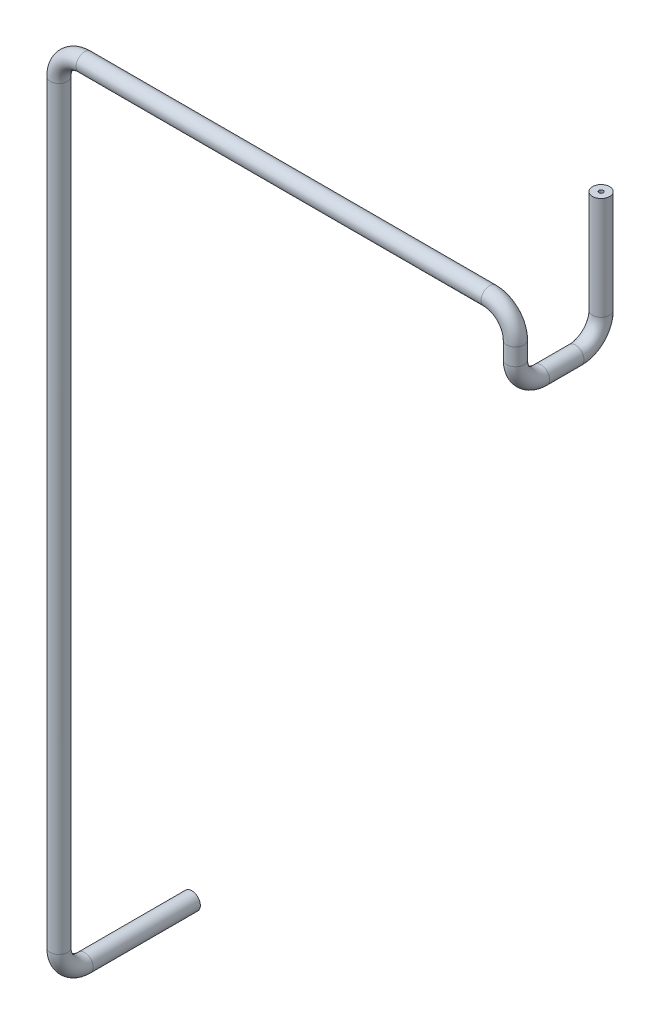
ISO-10303-21;
HEADER;
FILE_DESCRIPTION(('STEP AP214'),'2;1');
FILE_NAME('part.step','',(''),(''),'','','');
FILE_SCHEMA(('AUTOMOTIVE_DESIGN { 1 0 10303 214 1 1 1 1 }'));
ENDSEC;
DATA;
#1=APPLICATION_CONTEXT('core data for automotive mechanical design processes');
#2=APPLICATION_PROTOCOL_DEFINITION('international standard','automotive_design',2000,#1);
#3=PRODUCT_CONTEXT('',#1,'mechanical');
#4=PRODUCT('Part','Part','',(#3));
#5=PRODUCT_RELATED_PRODUCT_CATEGORY('part','',(#4));
#6=PRODUCT_DEFINITION_FORMATION('','',#4);
#7=PRODUCT_DEFINITION_CONTEXT('part definition',#1,'design');
#8=PRODUCT_DEFINITION('design','',#6,#7);
#9=PRODUCT_DEFINITION_SHAPE('','',#8);
#10=(LENGTH_UNIT() NAMED_UNIT(*) SI_UNIT(.MILLI.,.METRE.));
#11=(NAMED_UNIT(*) PLANE_ANGLE_UNIT() SI_UNIT($,.RADIAN.));
#12=(NAMED_UNIT(*) SI_UNIT($,.STERADIAN.) SOLID_ANGLE_UNIT());
#13=UNCERTAINTY_MEASURE_WITH_UNIT(LENGTH_MEASURE(1.E-05),#10,'distance_accuracy_value','');
#14=(GEOMETRIC_REPRESENTATION_CONTEXT(3) GLOBAL_UNCERTAINTY_ASSIGNED_CONTEXT((#13)) GLOBAL_UNIT_ASSIGNED_CONTEXT((#10,
#11,#12)) REPRESENTATION_CONTEXT('',''));
#15=CARTESIAN_POINT('',(0.,0.,0.));
#16=DIRECTION('',(0.,0.,1.));
#17=DIRECTION('',(1.,0.,0.));
#18=AXIS2_PLACEMENT_3D('',#15,#16,#17);
#19=CARTESIAN_POINT('',(-60.,402.,236.));
#20=DIRECTION('',(0.,1.,0.));
#21=DIRECTION('',(-1.,0.,0.));
#22=AXIS2_PLACEMENT_3D('',#19,#20,#21);
#23=PLANE('',#22);
#24=CARTESIAN_POINT('',(-60.,402.,236.));
#25=DIRECTION('',(0.,1.,0.));
#26=DIRECTION('',(-1.,0.,0.));
#27=AXIS2_PLACEMENT_3D('',#24,#25,#26);
#28=CIRCLE('',#27,0.5);
#29=CARTESIAN_POINT('',(-60.5,402.,236.));
#30=VERTEX_POINT('',#29);
#31=EDGE_CURVE('E361',#30,#30,#28,.T.);
#32=ORIENTED_EDGE('',*,*,#31,.F.);
#33=EDGE_LOOP('',(#32));
#34=FACE_BOUND('',#33,.T.);
#35=CARTESIAN_POINT('',(-60.,402.,236.));
#36=DIRECTION('',(0.,1.,0.));
#37=DIRECTION('',(0.,0.,1.));
#38=AXIS2_PLACEMENT_3D('',#35,#36,#37);
#39=CIRCLE('',#38,2.);
#40=CARTESIAN_POINT('',(-60.,402.,238.));
#41=VERTEX_POINT('',#40);
#42=EDGE_CURVE('E75',#41,#41,#39,.T.);
#43=ORIENTED_EDGE('',*,*,#42,.T.);
#44=EDGE_LOOP('',(#43));
#45=FACE_BOUND('',#44,.T.);
#46=ADVANCED_FACE('F52',(#34,#45),#23,.T.);
#47=CARTESIAN_POINT('',(-166.5,200.,225.));
#48=DIRECTION('',(0.,0.,1.));
#49=DIRECTION('',(1.,0.,0.));
#50=AXIS2_PLACEMENT_3D('',#47,#48,#49);
#51=PLANE('',#50);
#52=CARTESIAN_POINT('',(-166.5,200.,225.));
#53=DIRECTION('',(0.,0.,1.));
#54=DIRECTION('',(1.,0.,0.));
#55=AXIS2_PLACEMENT_3D('',#52,#53,#54);
#56=CIRCLE('',#55,0.5);
#57=CARTESIAN_POINT('',(-166.,200.,225.));
#58=VERTEX_POINT('',#57);
#59=EDGE_CURVE('E73',#58,#58,#56,.T.);
#60=ORIENTED_EDGE('',*,*,#59,.T.);
#61=EDGE_LOOP('',(#60));
#62=FACE_BOUND('',#61,.T.);
#63=CARTESIAN_POINT('',(-166.5,200.,225.));
#64=DIRECTION('',(0.,0.,1.));
#65=DIRECTION('',(1.,0.,0.));
#66=AXIS2_PLACEMENT_3D('',#63,#64,#65);
#67=CIRCLE('',#66,2.);
#68=CARTESIAN_POINT('',(-164.5,200.,225.));
#69=VERTEX_POINT('',#68);
#70=EDGE_CURVE('E11',#69,#69,#67,.T.);
#71=ORIENTED_EDGE('',*,*,#70,.F.);
#72=EDGE_LOOP('',(#71));
#73=FACE_BOUND('',#72,.T.);
#74=ADVANCED_FACE('F180',(#62,#73),#51,.F.);
#75=CARTESIAN_POINT('',(-60.,402.,236.));
#76=DIRECTION('',(0.,-1.,0.));
#77=DIRECTION('',(0.,0.,-1.));
#78=AXIS2_PLACEMENT_3D('',#75,#76,#77);
#79=CYLINDRICAL_SURFACE('',#78,2.);
#80=CARTESIAN_POINT('',(-60.,378.,236.));
#81=DIRECTION('',(0.,-1.,0.));
#82=DIRECTION('',(0.,0.,-1.));
#83=AXIS2_PLACEMENT_3D('',#80,#81,#82);
#84=CIRCLE('',#83,2.);
#85=CARTESIAN_POINT('',(-60.,378.,234.));
#86=VERTEX_POINT('',#85);
#87=EDGE_CURVE('E74',#86,#86,#84,.F.);
#88=ORIENTED_EDGE('',*,*,#87,.T.);
#89=EDGE_LOOP('',(#88));
#90=FACE_BOUND('',#89,.T.);
#91=ORIENTED_EDGE('',*,*,#42,.F.);
#92=EDGE_LOOP('',(#91));
#93=FACE_BOUND('',#92,.T.);
#94=ADVANCED_FACE('F179',(#90,#93),#79,.T.);
#95=CARTESIAN_POINT('',(-60.,378.,242.));
#96=DIRECTION('',(-1.,0.,0.));
#97=DIRECTION('',(0.,0.,1.));
#98=AXIS2_PLACEMENT_3D('',#95,#96,#97);
#99=TOROIDAL_SURFACE('',#98,6.00000000000001,2.);
#100=CARTESIAN_POINT('',(-60.,372.,242.));
#101=DIRECTION('',(0.,0.,-1.));
#102=DIRECTION('',(0.,1.,0.));
#103=AXIS2_PLACEMENT_3D('',#100,#101,#102);
#104=CIRCLE('',#103,2.);
#105=CARTESIAN_POINT('',(-60.,370.,242.));
#106=VERTEX_POINT('',#105);
#107=EDGE_CURVE('E78',#106,#106,#104,.T.);
#108=CARTESIAN_POINT('',(-60.,378.,242.));
#109=DIRECTION('',(-1.,0.,0.));
#110=DIRECTION('',(0.,0.,1.));
#111=AXIS2_PLACEMENT_3D('',#108,#109,#110);
#112=CIRCLE('',#111,8.00000000000001);
#113=EDGE_CURVE('',#86,#106,#112,.T.);
#114=ORIENTED_EDGE('',*,*,#87,.F.);
#115=ORIENTED_EDGE('',*,*,#107,.T.);
#116=ORIENTED_EDGE('',*,*,#113,.T.);
#117=ORIENTED_EDGE('',*,*,#113,.F.);
#118=EDGE_LOOP('',(#114,#116,#115,#117));
#119=FACE_BOUND('',#118,.T.);
#120=ADVANCED_FACE('F189',(#119),#99,.T.);
#121=CARTESIAN_POINT('',(-60.,372.,242.));
#122=DIRECTION('',(0.,0.,1.));
#123=DIRECTION('',(1.,0.,0.));
#124=AXIS2_PLACEMENT_3D('',#121,#122,#123);
#125=CYLINDRICAL_SURFACE('',#124,2.);
#126=CARTESIAN_POINT('',(-60.,372.,250.));
#127=DIRECTION('',(0.,0.,1.));
#128=DIRECTION('',(1.,0.,0.));
#129=AXIS2_PLACEMENT_3D('',#126,#127,#128);
#130=CIRCLE('',#129,2.);
#131=CARTESIAN_POINT('',(-60.,370.,250.));
#132=VERTEX_POINT('',#131);
#133=EDGE_CURVE('E91',#132,#132,#130,.F.);
#134=ORIENTED_EDGE('',*,*,#133,.T.);
#135=EDGE_LOOP('',(#134));
#136=FACE_BOUND('',#135,.T.);
#137=ORIENTED_EDGE('',*,*,#107,.F.);
#138=EDGE_LOOP('',(#137));
#139=FACE_BOUND('',#138,.T.);
#140=ADVANCED_FACE('F187',(#136,#139),#125,.T.);
#141=CARTESIAN_POINT('',(-60.,378.,250.));
#142=DIRECTION('',(-1.,0.,0.));
#143=DIRECTION('',(0.,0.,1.));
#144=AXIS2_PLACEMENT_3D('',#141,#142,#143);
#145=TOROIDAL_SURFACE('',#144,6.00000000000001,2.);
#146=CARTESIAN_POINT('',(-60.,378.,256.));
#147=DIRECTION('',(0.,-1.,0.));
#148=DIRECTION('',(0.,0.,-1.));
#149=AXIS2_PLACEMENT_3D('',#146,#147,#148);
#150=CIRCLE('',#149,2.);
#151=CARTESIAN_POINT('',(-60.,378.,258.));
#152=VERTEX_POINT('',#151);
#153=EDGE_CURVE('E96',#152,#152,#150,.T.);
#154=CARTESIAN_POINT('',(-60.,378.,250.));
#155=DIRECTION('',(-1.,0.,0.));
#156=DIRECTION('',(0.,0.,1.));
#157=AXIS2_PLACEMENT_3D('',#154,#155,#156);
#158=CIRCLE('',#157,8.00000000000001);
#159=EDGE_CURVE('',#132,#152,#158,.T.);
#160=ORIENTED_EDGE('',*,*,#133,.F.);
#161=ORIENTED_EDGE('',*,*,#153,.T.);
#162=ORIENTED_EDGE('',*,*,#159,.T.);
#163=ORIENTED_EDGE('',*,*,#159,.F.);
#164=EDGE_LOOP('',(#160,#162,#161,#163));
#165=FACE_BOUND('',#164,.T.);
#166=ADVANCED_FACE('F193',(#165),#145,.T.);
#167=CARTESIAN_POINT('',(-60.,378.,256.));
#168=DIRECTION('',(0.,1.,0.));
#169=DIRECTION('',(-1.,0.,0.));
#170=AXIS2_PLACEMENT_3D('',#167,#168,#169);
#171=CYLINDRICAL_SURFACE('',#170,2.);
#172=CARTESIAN_POINT('',(-60.,382.,256.));
#173=DIRECTION('',(0.,1.,0.));
#174=DIRECTION('',(-1.,0.,0.));
#175=AXIS2_PLACEMENT_3D('',#172,#173,#174);
#176=CIRCLE('',#175,2.);
#177=CARTESIAN_POINT('',(-58.,382.,256.));
#178=VERTEX_POINT('',#177);
#179=EDGE_CURVE('E97',#178,#178,#176,.F.);
#180=ORIENTED_EDGE('',*,*,#179,.T.);
#181=EDGE_LOOP('',(#180));
#182=FACE_BOUND('',#181,.T.);
#183=ORIENTED_EDGE('',*,*,#153,.F.);
#184=EDGE_LOOP('',(#183));
#185=FACE_BOUND('',#184,.T.);
#186=ADVANCED_FACE('F196',(#182,#185),#171,.T.);
#187=CARTESIAN_POINT('',(-66.,382.,256.));
#188=DIRECTION('',(0.,0.,1.));
#189=DIRECTION('',(1.,0.,0.));
#190=AXIS2_PLACEMENT_3D('',#187,#188,#189);
#191=TOROIDAL_SURFACE('',#190,6.00000000000001,2.);
#192=CARTESIAN_POINT('',(-66.,388.,256.));
#193=DIRECTION('',(1.,0.,0.));
#194=DIRECTION('',(0.,1.,0.));
#195=AXIS2_PLACEMENT_3D('',#192,#193,#194);
#196=CIRCLE('',#195,2.);
#197=CARTESIAN_POINT('',(-66.,390.,256.));
#198=VERTEX_POINT('',#197);
#199=EDGE_CURVE('E105',#198,#198,#196,.T.);
#200=CARTESIAN_POINT('',(-66.,382.,256.));
#201=DIRECTION('',(0.,0.,1.));
#202=DIRECTION('',(1.,0.,0.));
#203=AXIS2_PLACEMENT_3D('',#200,#201,#202);
#204=CIRCLE('',#203,8.00000000000001);
#205=EDGE_CURVE('',#178,#198,#204,.T.);
#206=ORIENTED_EDGE('',*,*,#179,.F.);
#207=ORIENTED_EDGE('',*,*,#199,.T.);
#208=ORIENTED_EDGE('',*,*,#205,.T.);
#209=ORIENTED_EDGE('',*,*,#205,.F.);
#210=EDGE_LOOP('',(#206,#208,#207,#209));
#211=FACE_BOUND('',#210,.T.);
#212=ADVANCED_FACE('F205',(#211),#191,.T.);
#213=CARTESIAN_POINT('',(-66.,388.,256.));
#214=DIRECTION('',(-1.,0.,0.));
#215=DIRECTION('',(0.,0.,1.));
#216=AXIS2_PLACEMENT_3D('',#213,#214,#215);
#217=CYLINDRICAL_SURFACE('',#216,2.);
#218=CARTESIAN_POINT('',(-160.5,388.,256.));
#219=DIRECTION('',(-1.,0.,0.));
#220=DIRECTION('',(0.,0.,1.));
#221=AXIS2_PLACEMENT_3D('',#218,#219,#220);
#222=CIRCLE('',#221,2.);
#223=CARTESIAN_POINT('',(-160.5,390.,256.));
#224=VERTEX_POINT('',#223);
#225=EDGE_CURVE('E104',#224,#224,#222,.F.);
#226=ORIENTED_EDGE('',*,*,#225,.T.);
#227=EDGE_LOOP('',(#226));
#228=FACE_BOUND('',#227,.T.);
#229=ORIENTED_EDGE('',*,*,#199,.F.);
#230=EDGE_LOOP('',(#229));
#231=FACE_BOUND('',#230,.T.);
#232=ADVANCED_FACE('F125',(#228,#231),#217,.T.);
#233=CARTESIAN_POINT('',(-160.5,382.,256.));
#234=DIRECTION('',(0.,0.,1.));
#235=DIRECTION('',(1.,0.,0.));
#236=AXIS2_PLACEMENT_3D('',#233,#234,#235);
#237=TOROIDAL_SURFACE('',#236,6.00000000000001,2.);
#238=CARTESIAN_POINT('',(-166.5,382.,256.));
#239=DIRECTION('',(0.,1.,0.));
#240=DIRECTION('',(-1.,0.,0.));
#241=AXIS2_PLACEMENT_3D('',#238,#239,#240);
#242=CIRCLE('',#241,2.);
#243=CARTESIAN_POINT('',(-168.5,382.,256.));
#244=VERTEX_POINT('',#243);
#245=EDGE_CURVE('E68',#244,#244,#242,.T.);
#246=CARTESIAN_POINT('',(-160.5,382.,256.));
#247=DIRECTION('',(0.,0.,1.));
#248=DIRECTION('',(1.,0.,0.));
#249=AXIS2_PLACEMENT_3D('',#246,#247,#248);
#250=CIRCLE('',#249,8.00000000000001);
#251=EDGE_CURVE('',#224,#244,#250,.T.);
#252=ORIENTED_EDGE('',*,*,#225,.F.);
#253=ORIENTED_EDGE('',*,*,#245,.T.);
#254=ORIENTED_EDGE('',*,*,#251,.T.);
#255=ORIENTED_EDGE('',*,*,#251,.F.);
#256=EDGE_LOOP('',(#252,#254,#253,#255));
#257=FACE_BOUND('',#256,.T.);
#258=ADVANCED_FACE('F109',(#257),#237,.T.);
#259=CARTESIAN_POINT('',(-166.5,382.,256.));
#260=DIRECTION('',(0.,-1.,0.));
#261=DIRECTION('',(0.,0.,-1.));
#262=AXIS2_PLACEMENT_3D('',#259,#260,#261);
#263=CYLINDRICAL_SURFACE('',#262,2.);
#264=CARTESIAN_POINT('',(-166.5,206.,256.));
#265=DIRECTION('',(0.,-1.,0.));
#266=DIRECTION('',(0.,0.,-1.));
#267=AXIS2_PLACEMENT_3D('',#264,#265,#266);
#268=CIRCLE('',#267,2.);
#269=CARTESIAN_POINT('',(-166.5,206.,258.));
#270=VERTEX_POINT('',#269);
#271=EDGE_CURVE('E63',#270,#270,#268,.F.);
#272=ORIENTED_EDGE('',*,*,#271,.T.);
#273=EDGE_LOOP('',(#272));
#274=FACE_BOUND('',#273,.T.);
#275=ORIENTED_EDGE('',*,*,#245,.F.);
#276=EDGE_LOOP('',(#275));
#277=FACE_BOUND('',#276,.T.);
#278=ADVANCED_FACE('F114',(#274,#277),#263,.T.);
#279=CARTESIAN_POINT('',(-166.5,206.,250.));
#280=DIRECTION('',(1.,0.,0.));
#281=DIRECTION('',(0.,0.,-1.));
#282=AXIS2_PLACEMENT_3D('',#279,#280,#281);
#283=TOROIDAL_SURFACE('',#282,6.00000000000001,2.);
#284=CARTESIAN_POINT('',(-166.5,200.,250.000000000002));
#285=DIRECTION('',(0.,3.14598857593716E-13,1.));
#286=DIRECTION('',(0.,-1.,3.14598857593716E-13));
#287=AXIS2_PLACEMENT_3D('',#284,#285,#286);
#288=CIRCLE('',#287,2.);
#289=CARTESIAN_POINT('',(-166.5,198.,250.000000000003));
#290=VERTEX_POINT('',#289);
#291=EDGE_CURVE('E58',#290,#290,#288,.T.);
#292=CARTESIAN_POINT('',(-166.5,206.,250.));
#293=DIRECTION('',(1.,0.,0.));
#294=DIRECTION('',(0.,0.,-1.));
#295=AXIS2_PLACEMENT_3D('',#292,#293,#294);
#296=CIRCLE('',#295,8.00000000000001);
#297=EDGE_CURVE('',#270,#290,#296,.T.);
#298=ORIENTED_EDGE('',*,*,#271,.F.);
#299=ORIENTED_EDGE('',*,*,#291,.T.);
#300=ORIENTED_EDGE('',*,*,#297,.T.);
#301=ORIENTED_EDGE('',*,*,#297,.F.);
#302=EDGE_LOOP('',(#298,#300,#299,#301));
#303=FACE_BOUND('',#302,.T.);
#304=ADVANCED_FACE('F113',(#303),#283,.T.);
#305=CARTESIAN_POINT('',(-166.5,200.,250.));
#306=DIRECTION('',(0.,0.,-1.));
#307=DIRECTION('',(-1.,0.,0.));
#308=AXIS2_PLACEMENT_3D('',#305,#306,#307);
#309=CYLINDRICAL_SURFACE('',#308,2.);
#310=ORIENTED_EDGE('',*,*,#70,.T.);
#311=EDGE_LOOP('',(#310));
#312=FACE_BOUND('',#311,.T.);
#313=ORIENTED_EDGE('',*,*,#291,.F.);
#314=EDGE_LOOP('',(#313));
#315=FACE_BOUND('',#314,.T.);
#316=ADVANCED_FACE('F54',(#312,#315),#309,.T.);
#317=CARTESIAN_POINT('',(-60.,402.,236.));
#318=DIRECTION('',(0.,-1.,0.));
#319=DIRECTION('',(0.,0.,-1.));
#320=AXIS2_PLACEMENT_3D('',#317,#318,#319);
#321=CYLINDRICAL_SURFACE('',#320,0.5);
#322=CARTESIAN_POINT('',(-60.,378.,236.));
#323=DIRECTION('',(0.,1.,0.));
#324=DIRECTION('',(-1.,0.,0.));
#325=AXIS2_PLACEMENT_3D('',#322,#323,#324);
#326=CIRCLE('',#325,0.5);
#327=CARTESIAN_POINT('',(-60.,378.,235.5));
#328=VERTEX_POINT('',#327);
#329=EDGE_CURVE('E365',#328,#328,#326,.T.);
#330=ORIENTED_EDGE('',*,*,#329,.F.);
#331=EDGE_LOOP('',(#330));
#332=FACE_BOUND('',#331,.T.);
#333=ORIENTED_EDGE('',*,*,#31,.T.);
#334=EDGE_LOOP('',(#333));
#335=FACE_BOUND('',#334,.T.);
#336=ADVANCED_FACE('F124',(#332,#335),#321,.F.);
#337=CARTESIAN_POINT('',(-60.,378.,242.));
#338=DIRECTION('',(-1.,0.,0.));
#339=DIRECTION('',(0.,0.,1.));
#340=AXIS2_PLACEMENT_3D('',#337,#338,#339);
#341=TOROIDAL_SURFACE('',#340,6.00000000000001,0.5);
#342=CARTESIAN_POINT('',(-60.,372.,242.));
#343=DIRECTION('',(0.,0.,-1.));
#344=DIRECTION('',(-1.,0.,0.));
#345=AXIS2_PLACEMENT_3D('',#342,#343,#344);
#346=CIRCLE('',#345,0.5);
#347=CARTESIAN_POINT('',(-60.,371.5,242.));
#348=VERTEX_POINT('',#347);
#349=EDGE_CURVE('E370',#348,#348,#346,.T.);
#350=CARTESIAN_POINT('',(-60.,378.,242.));
#351=DIRECTION('',(-1.,0.,0.));
#352=DIRECTION('',(0.,0.,1.));
#353=AXIS2_PLACEMENT_3D('',#350,#351,#352);
#354=CIRCLE('',#353,6.50000000000001);
#355=EDGE_CURVE('',#328,#348,#354,.T.);
#356=ORIENTED_EDGE('',*,*,#329,.T.);
#357=ORIENTED_EDGE('',*,*,#349,.F.);
#358=ORIENTED_EDGE('',*,*,#355,.T.);
#359=ORIENTED_EDGE('',*,*,#355,.F.);
#360=EDGE_LOOP('',(#356,#358,#357,#359));
#361=FACE_BOUND('',#360,.T.);
#362=ADVANCED_FACE('F129',(#361),#341,.F.);
#363=CARTESIAN_POINT('',(-60.,372.,242.));
#364=DIRECTION('',(0.,0.,1.));
#365=DIRECTION('',(1.,0.,0.));
#366=AXIS2_PLACEMENT_3D('',#363,#364,#365);
#367=CYLINDRICAL_SURFACE('',#366,0.5);
#368=CARTESIAN_POINT('',(-60.,372.,250.));
#369=DIRECTION('',(0.,0.,-1.));
#370=DIRECTION('',(-1.,0.,0.));
#371=AXIS2_PLACEMENT_3D('',#368,#369,#370);
#372=CIRCLE('',#371,0.5);
#373=CARTESIAN_POINT('',(-60.,371.5,250.));
#374=VERTEX_POINT('',#373);
#375=EDGE_CURVE('E375',#374,#374,#372,.T.);
#376=ORIENTED_EDGE('',*,*,#375,.F.);
#377=EDGE_LOOP('',(#376));
#378=FACE_BOUND('',#377,.T.);
#379=ORIENTED_EDGE('',*,*,#349,.T.);
#380=EDGE_LOOP('',(#379));
#381=FACE_BOUND('',#380,.T.);
#382=ADVANCED_FACE('F136',(#378,#381),#367,.F.);
#383=CARTESIAN_POINT('',(-60.,378.,250.));
#384=DIRECTION('',(-1.,0.,0.));
#385=DIRECTION('',(0.,0.,1.));
#386=AXIS2_PLACEMENT_3D('',#383,#384,#385);
#387=TOROIDAL_SURFACE('',#386,6.00000000000001,0.5);
#388=CARTESIAN_POINT('',(-60.,378.,256.));
#389=DIRECTION('',(0.,-1.,0.));
#390=DIRECTION('',(-1.,0.,0.));
#391=AXIS2_PLACEMENT_3D('',#388,#389,#390);
#392=CIRCLE('',#391,0.5);
#393=CARTESIAN_POINT('',(-60.,378.,256.5));
#394=VERTEX_POINT('',#393);
#395=EDGE_CURVE('E374',#394,#394,#392,.T.);
#396=CARTESIAN_POINT('',(-60.,378.,250.));
#397=DIRECTION('',(-1.,0.,0.));
#398=DIRECTION('',(0.,0.,1.));
#399=AXIS2_PLACEMENT_3D('',#396,#397,#398);
#400=CIRCLE('',#399,6.50000000000001);
#401=EDGE_CURVE('',#374,#394,#400,.T.);
#402=ORIENTED_EDGE('',*,*,#375,.T.);
#403=ORIENTED_EDGE('',*,*,#395,.F.);
#404=ORIENTED_EDGE('',*,*,#401,.T.);
#405=ORIENTED_EDGE('',*,*,#401,.F.);
#406=EDGE_LOOP('',(#402,#404,#403,#405));
#407=FACE_BOUND('',#406,.T.);
#408=ADVANCED_FACE('F145',(#407),#387,.F.);
#409=CARTESIAN_POINT('',(-60.,378.,256.));
#410=DIRECTION('',(0.,1.,0.));
#411=DIRECTION('',(-1.,0.,0.));
#412=AXIS2_PLACEMENT_3D('',#409,#410,#411);
#413=CYLINDRICAL_SURFACE('',#412,0.5);
#414=CARTESIAN_POINT('',(-60.,382.,256.));
#415=DIRECTION('',(0.,-1.,0.));
#416=DIRECTION('',(-1.,0.,0.));
#417=AXIS2_PLACEMENT_3D('',#414,#415,#416);
#418=CIRCLE('',#417,0.5);
#419=CARTESIAN_POINT('',(-59.5,382.,256.));
#420=VERTEX_POINT('',#419);
#421=EDGE_CURVE('E378',#420,#420,#418,.T.);
#422=ORIENTED_EDGE('',*,*,#421,.F.);
#423=EDGE_LOOP('',(#422));
#424=FACE_BOUND('',#423,.T.);
#425=ORIENTED_EDGE('',*,*,#395,.T.);
#426=EDGE_LOOP('',(#425));
#427=FACE_BOUND('',#426,.T.);
#428=ADVANCED_FACE('F146',(#424,#427),#413,.F.);
#429=CARTESIAN_POINT('',(-66.,382.,256.));
#430=DIRECTION('',(0.,0.,1.));
#431=DIRECTION('',(1.,0.,0.));
#432=AXIS2_PLACEMENT_3D('',#429,#430,#431);
#433=TOROIDAL_SURFACE('',#432,6.00000000000001,0.5);
#434=CARTESIAN_POINT('',(-66.,388.,256.));
#435=DIRECTION('',(1.,0.,0.));
#436=DIRECTION('',(0.,-1.,0.));
#437=AXIS2_PLACEMENT_3D('',#434,#435,#436);
#438=CIRCLE('',#437,0.5);
#439=CARTESIAN_POINT('',(-66.,388.5,256.));
#440=VERTEX_POINT('',#439);
#441=EDGE_CURVE('E381',#440,#440,#438,.T.);
#442=CARTESIAN_POINT('',(-66.,382.,256.));
#443=DIRECTION('',(0.,0.,1.));
#444=DIRECTION('',(1.,0.,0.));
#445=AXIS2_PLACEMENT_3D('',#442,#443,#444);
#446=CIRCLE('',#445,6.50000000000001);
#447=EDGE_CURVE('',#420,#440,#446,.T.);
#448=ORIENTED_EDGE('',*,*,#421,.T.);
#449=ORIENTED_EDGE('',*,*,#441,.F.);
#450=ORIENTED_EDGE('',*,*,#447,.T.);
#451=ORIENTED_EDGE('',*,*,#447,.F.);
#452=EDGE_LOOP('',(#448,#450,#449,#451));
#453=FACE_BOUND('',#452,.T.);
#454=ADVANCED_FACE('F155',(#453),#433,.F.);
#455=CARTESIAN_POINT('',(-66.,388.,256.));
#456=DIRECTION('',(-1.,0.,0.));
#457=DIRECTION('',(0.,0.,1.));
#458=AXIS2_PLACEMENT_3D('',#455,#456,#457);
#459=CYLINDRICAL_SURFACE('',#458,0.5);
#460=CARTESIAN_POINT('',(-160.5,388.,256.));
#461=DIRECTION('',(1.,0.,0.));
#462=DIRECTION('',(0.,-1.,0.));
#463=AXIS2_PLACEMENT_3D('',#460,#461,#462);
#464=CIRCLE('',#463,0.5);
#465=CARTESIAN_POINT('',(-160.5,388.5,256.));
#466=VERTEX_POINT('',#465);
#467=EDGE_CURVE('E383',#466,#466,#464,.T.);
#468=ORIENTED_EDGE('',*,*,#467,.F.);
#469=EDGE_LOOP('',(#468));
#470=FACE_BOUND('',#469,.T.);
#471=ORIENTED_EDGE('',*,*,#441,.T.);
#472=EDGE_LOOP('',(#471));
#473=FACE_BOUND('',#472,.T.);
#474=ADVANCED_FACE('F156',(#470,#473),#459,.F.);
#475=CARTESIAN_POINT('',(-160.5,382.,256.));
#476=DIRECTION('',(0.,0.,1.));
#477=DIRECTION('',(1.,0.,0.));
#478=AXIS2_PLACEMENT_3D('',#475,#476,#477);
#479=TOROIDAL_SURFACE('',#478,6.00000000000001,0.5);
#480=CARTESIAN_POINT('',(-166.5,382.,256.));
#481=DIRECTION('',(0.,1.,0.));
#482=DIRECTION('',(1.,0.,0.));
#483=AXIS2_PLACEMENT_3D('',#480,#481,#482);
#484=CIRCLE('',#483,0.5);
#485=CARTESIAN_POINT('',(-167.,382.,256.));
#486=VERTEX_POINT('',#485);
#487=EDGE_CURVE('E390',#486,#486,#484,.T.);
#488=CARTESIAN_POINT('',(-160.5,382.,256.));
#489=DIRECTION('',(0.,0.,1.));
#490=DIRECTION('',(1.,0.,0.));
#491=AXIS2_PLACEMENT_3D('',#488,#489,#490);
#492=CIRCLE('',#491,6.50000000000001);
#493=EDGE_CURVE('',#466,#486,#492,.T.);
#494=ORIENTED_EDGE('',*,*,#467,.T.);
#495=ORIENTED_EDGE('',*,*,#487,.F.);
#496=ORIENTED_EDGE('',*,*,#493,.T.);
#497=ORIENTED_EDGE('',*,*,#493,.F.);
#498=EDGE_LOOP('',(#494,#496,#495,#497));
#499=FACE_BOUND('',#498,.T.);
#500=ADVANCED_FACE('F159',(#499),#479,.F.);
#501=CARTESIAN_POINT('',(-166.5,382.,256.));
#502=DIRECTION('',(0.,-1.,0.));
#503=DIRECTION('',(0.,0.,-1.));
#504=AXIS2_PLACEMENT_3D('',#501,#502,#503);
#505=CYLINDRICAL_SURFACE('',#504,0.5);
#506=CARTESIAN_POINT('',(-166.5,206.,256.));
#507=DIRECTION('',(0.,1.,0.));
#508=DIRECTION('',(1.,0.,0.));
#509=AXIS2_PLACEMENT_3D('',#506,#507,#508);
#510=CIRCLE('',#509,0.5);
#511=CARTESIAN_POINT('',(-166.5,206.,256.5));
#512=VERTEX_POINT('',#511);
#513=EDGE_CURVE('E87',#512,#512,#510,.T.);
#514=ORIENTED_EDGE('',*,*,#513,.F.);
#515=EDGE_LOOP('',(#514));
#516=FACE_BOUND('',#515,.T.);
#517=ORIENTED_EDGE('',*,*,#487,.T.);
#518=EDGE_LOOP('',(#517));
#519=FACE_BOUND('',#518,.T.);
#520=ADVANCED_FACE('F163',(#516,#519),#505,.F.);
#521=CARTESIAN_POINT('',(-166.5,206.,250.));
#522=DIRECTION('',(1.,0.,0.));
#523=DIRECTION('',(0.,0.,-1.));
#524=AXIS2_PLACEMENT_3D('',#521,#522,#523);
#525=TOROIDAL_SURFACE('',#524,6.00000000000001,0.5);
#526=CARTESIAN_POINT('',(-166.5,199.999999999998,250.000000000002));
#527=DIRECTION('',(0.,0.,1.));
#528=DIRECTION('',(1.,0.,0.));
#529=AXIS2_PLACEMENT_3D('',#526,#527,#528);
#530=CIRCLE('',#529,0.5);
#531=CARTESIAN_POINT('',(-166.5,199.5,250.000000000002));
#532=VERTEX_POINT('',#531);
#533=EDGE_CURVE('E85',#532,#532,#530,.T.);
#534=CARTESIAN_POINT('',(-166.5,206.,250.));
#535=DIRECTION('',(1.,0.,0.));
#536=DIRECTION('',(0.,0.,-1.));
#537=AXIS2_PLACEMENT_3D('',#534,#535,#536);
#538=CIRCLE('',#537,6.50000000000001);
#539=EDGE_CURVE('',#512,#532,#538,.T.);
#540=ORIENTED_EDGE('',*,*,#513,.T.);
#541=ORIENTED_EDGE('',*,*,#533,.F.);
#542=ORIENTED_EDGE('',*,*,#539,.T.);
#543=ORIENTED_EDGE('',*,*,#539,.F.);
#544=EDGE_LOOP('',(#540,#542,#541,#543));
#545=FACE_BOUND('',#544,.T.);
#546=ADVANCED_FACE('F169',(#545),#525,.F.);
#547=CARTESIAN_POINT('',(-166.5,200.,250.));
#548=DIRECTION('',(0.,0.,-1.));
#549=DIRECTION('',(-1.,0.,0.));
#550=AXIS2_PLACEMENT_3D('',#547,#548,#549);
#551=CYLINDRICAL_SURFACE('',#550,0.5);
#552=ORIENTED_EDGE('',*,*,#59,.F.);
#553=EDGE_LOOP('',(#552));
#554=FACE_BOUND('',#553,.T.);
#555=ORIENTED_EDGE('',*,*,#533,.T.);
#556=EDGE_LOOP('',(#555));
#557=FACE_BOUND('',#556,.T.);
#558=ADVANCED_FACE('F171',(#554,#557),#551,.F.);
#559=CLOSED_SHELL('',(#46,#74,#94,#120,#140,#166,#186,#212,#232,#258,#278,#304,#316,#336,#362,
#382,#408,#428,#454,#474,#500,#520,#546,#558));
#560=MANIFOLD_SOLID_BREP('B2',#559);
#561=ADVANCED_BREP_SHAPE_REPRESENTATION('',(#18,#560),#14);
#562=SHAPE_DEFINITION_REPRESENTATION(#9,#561);
ENDSEC;
END-ISO-10303-21;
